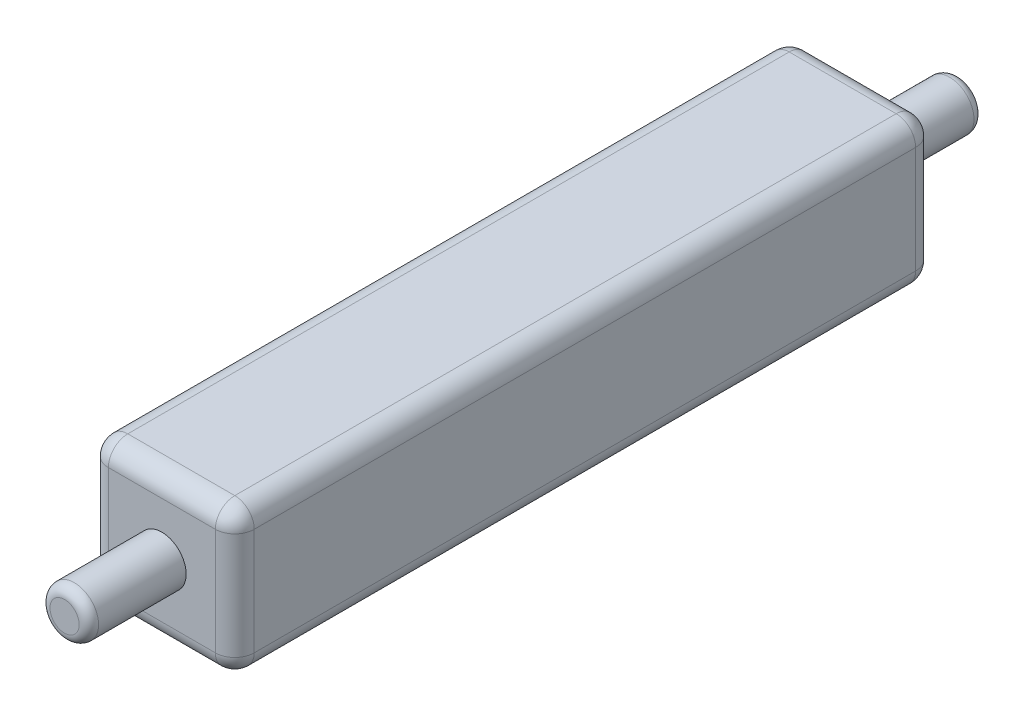
ISO-10303-21;
HEADER;
FILE_DESCRIPTION(('STEP AP214'),'2;1');
FILE_NAME('part.step','',(''),(''),'','','');
FILE_SCHEMA(('AUTOMOTIVE_DESIGN { 1 0 10303 214 1 1 1 1 }'));
ENDSEC;
DATA;
#1=APPLICATION_CONTEXT('core data for automotive mechanical design processes');
#2=APPLICATION_PROTOCOL_DEFINITION('international standard','automotive_design',2000,#1);
#3=PRODUCT_CONTEXT('',#1,'mechanical');
#4=PRODUCT('Part','Part','',(#3));
#5=PRODUCT_RELATED_PRODUCT_CATEGORY('part','',(#4));
#6=PRODUCT_DEFINITION_FORMATION('','',#4);
#7=PRODUCT_DEFINITION_CONTEXT('part definition',#1,'design');
#8=PRODUCT_DEFINITION('design','',#6,#7);
#9=PRODUCT_DEFINITION_SHAPE('','',#8);
#10=(LENGTH_UNIT() NAMED_UNIT(*) SI_UNIT(.MILLI.,.METRE.));
#11=(NAMED_UNIT(*) PLANE_ANGLE_UNIT() SI_UNIT($,.RADIAN.));
#12=(NAMED_UNIT(*) SI_UNIT($,.STERADIAN.) SOLID_ANGLE_UNIT());
#13=UNCERTAINTY_MEASURE_WITH_UNIT(LENGTH_MEASURE(1.E-05),#10,'distance_accuracy_value','');
#14=(GEOMETRIC_REPRESENTATION_CONTEXT(3) GLOBAL_UNCERTAINTY_ASSIGNED_CONTEXT((#13)) GLOBAL_UNIT_ASSIGNED_CONTEXT((#10,
#11,#12)) REPRESENTATION_CONTEXT('',''));
#15=CARTESIAN_POINT('',(0.,0.,0.));
#16=DIRECTION('',(0.,0.,1.));
#17=DIRECTION('',(1.,0.,0.));
#18=AXIS2_PLACEMENT_3D('',#15,#16,#17);
#19=CARTESIAN_POINT('',(-7.5,7.5,-9.));
#20=DIRECTION('',(0.,0.,-1.));
#21=DIRECTION('',(-1.,0.,0.));
#22=AXIS2_PLACEMENT_3D('',#19,#20,#21);
#23=TOROIDAL_SURFACE('',#22,1.5,1.);
#24=CARTESIAN_POINT('',(-7.5,7.5,-10.));
#25=DIRECTION('',(0.,0.,-1.));
#26=DIRECTION('',(-1.,0.,0.));
#27=AXIS2_PLACEMENT_3D('',#24,#25,#26);
#28=CIRCLE('',#27,1.5);
#29=CARTESIAN_POINT('',(-9.,7.5,-10.));
#30=VERTEX_POINT('',#29);
#31=EDGE_CURVE('E41',#30,#30,#28,.T.);
#32=ORIENTED_EDGE('',*,*,#31,.F.);
#33=EDGE_LOOP('',(#32));
#34=FACE_BOUND('',#33,.T.);
#35=CARTESIAN_POINT('',(-7.5,7.5,-9.));
#36=DIRECTION('',(0.,0.,-1.));
#37=DIRECTION('',(-1.,0.,0.));
#38=AXIS2_PLACEMENT_3D('',#35,#36,#37);
#39=CIRCLE('',#38,2.5);
#40=CARTESIAN_POINT('',(-10.,7.5,-9.));
#41=VERTEX_POINT('',#40);
#42=EDGE_CURVE('E11',#41,#41,#39,.F.);
#43=ORIENTED_EDGE('',*,*,#42,.F.);
#44=EDGE_LOOP('',(#43));
#45=FACE_BOUND('',#44,.T.);
#46=ADVANCED_FACE('F34',(#34,#45),#23,.T.);
#47=CARTESIAN_POINT('',(-7.5,7.5,81.));
#48=DIRECTION('',(0.,0.,1.));
#49=DIRECTION('',(1.,0.,0.));
#50=AXIS2_PLACEMENT_3D('',#47,#48,#49);
#51=TOROIDAL_SURFACE('',#50,1.5,1.);
#52=CARTESIAN_POINT('',(-7.5,7.5,82.));
#53=DIRECTION('',(0.,0.,1.));
#54=DIRECTION('',(1.,0.,0.));
#55=AXIS2_PLACEMENT_3D('',#52,#53,#54);
#56=CIRCLE('',#55,1.5);
#57=CARTESIAN_POINT('',(-6.,7.5,82.));
#58=VERTEX_POINT('',#57);
#59=EDGE_CURVE('E376',#58,#58,#56,.T.);
#60=ORIENTED_EDGE('',*,*,#59,.F.);
#61=EDGE_LOOP('',(#60));
#62=FACE_BOUND('',#61,.T.);
#63=CARTESIAN_POINT('',(-7.5,7.5,81.));
#64=DIRECTION('',(0.,0.,1.));
#65=DIRECTION('',(1.,0.,0.));
#66=AXIS2_PLACEMENT_3D('',#63,#64,#65);
#67=CIRCLE('',#66,2.5);
#68=CARTESIAN_POINT('',(-5.,7.5,81.));
#69=VERTEX_POINT('',#68);
#70=EDGE_CURVE('E379',#69,#69,#67,.F.);
#71=ORIENTED_EDGE('',*,*,#70,.F.);
#72=EDGE_LOOP('',(#71));
#73=FACE_BOUND('',#72,.T.);
#74=ADVANCED_FACE('F388',(#62,#73),#51,.T.);
#75=CARTESIAN_POINT('',(0.,2.,70.));
#76=DIRECTION('',(-1.,0.,0.));
#77=DIRECTION('',(0.,-1.,0.));
#78=AXIS2_PLACEMENT_3D('',#75,#76,#77);
#79=CYLINDRICAL_SURFACE('',#78,2.);
#80=CARTESIAN_POINT('',(-2.,2.,70.));
#81=DIRECTION('',(1.,0.,0.));
#82=DIRECTION('',(0.,1.,0.));
#83=AXIS2_PLACEMENT_3D('',#80,#81,#82);
#84=CIRCLE('',#83,2.);
#85=CARTESIAN_POINT('',(-2.,2.,72.));
#86=VERTEX_POINT('',#85);
#87=CARTESIAN_POINT('',(-2.,0.,70.));
#88=VERTEX_POINT('',#87);
#89=EDGE_CURVE('E374',#86,#88,#84,.T.);
#90=ORIENTED_EDGE('',*,*,#89,.F.);
#91=DIRECTION('',(1.,0.,0.));
#92=VECTOR('',#91,1.);
#93=CARTESIAN_POINT('',(0.,2.,72.));
#94=LINE('',#93,#92);
#95=CARTESIAN_POINT('',(-13.,2.,72.));
#96=VERTEX_POINT('',#95);
#97=EDGE_CURVE('E331',#96,#86,#94,.T.);
#98=ORIENTED_EDGE('',*,*,#97,.F.);
#99=CARTESIAN_POINT('',(-13.,2.,70.));
#100=DIRECTION('',(1.,0.,0.));
#101=DIRECTION('',(0.,0.,-1.));
#102=AXIS2_PLACEMENT_3D('',#99,#100,#101);
#103=CIRCLE('',#102,2.);
#104=CARTESIAN_POINT('',(-13.,0.,70.));
#105=VERTEX_POINT('',#104);
#106=EDGE_CURVE('E48',#96,#105,#103,.T.);
#107=ORIENTED_EDGE('',*,*,#106,.T.);
#108=DIRECTION('',(1.,0.,0.));
#109=VECTOR('',#108,1.);
#110=CARTESIAN_POINT('',(0.,0.,70.));
#111=LINE('',#110,#109);
#112=EDGE_CURVE('E360',#88,#105,#111,.F.);
#113=ORIENTED_EDGE('',*,*,#112,.F.);
#114=EDGE_LOOP('',(#90,#98,#107,#113));
#115=FACE_BOUND('',#114,.T.);
#116=ADVANCED_FACE('F499',(#115),#79,.T.);
#117=CARTESIAN_POINT('',(-13.,2.,70.));
#118=DIRECTION('',(0.,0.,1.));
#119=DIRECTION('',(1.,0.,0.));
#120=AXIS2_PLACEMENT_3D('',#117,#118,#119);
#121=SPHERICAL_SURFACE('',#120,2.);
#122=ORIENTED_EDGE('',*,*,#106,.F.);
#123=CARTESIAN_POINT('',(-13.,2.,70.));
#124=DIRECTION('',(0.,-1.,0.));
#125=DIRECTION('',(0.,0.,-1.));
#126=AXIS2_PLACEMENT_3D('',#123,#124,#125);
#127=CIRCLE('',#126,2.);
#128=CARTESIAN_POINT('',(-15.,2.,70.));
#129=VERTEX_POINT('',#128);
#130=EDGE_CURVE('E55',#96,#129,#127,.T.);
#131=ORIENTED_EDGE('',*,*,#130,.T.);
#132=CARTESIAN_POINT('',(-13.,2.,70.));
#133=DIRECTION('',(0.,0.,1.));
#134=DIRECTION('',(1.,0.,0.));
#135=AXIS2_PLACEMENT_3D('',#132,#133,#134);
#136=CIRCLE('',#135,2.);
#137=EDGE_CURVE('E358',#105,#129,#136,.F.);
#138=ORIENTED_EDGE('',*,*,#137,.F.);
#139=EDGE_LOOP('',(#122,#131,#138));
#140=FACE_BOUND('',#139,.T.);
#141=ADVANCED_FACE('F495',(#140),#121,.T.);
#142=CARTESIAN_POINT('',(-13.,0.,70.));
#143=DIRECTION('',(0.,1.,0.));
#144=DIRECTION('',(0.,0.,1.));
#145=AXIS2_PLACEMENT_3D('',#142,#143,#144);
#146=CYLINDRICAL_SURFACE('',#145,2.);
#147=ORIENTED_EDGE('',*,*,#130,.F.);
#148=DIRECTION('',(0.,-1.,0.));
#149=VECTOR('',#148,1.);
#150=CARTESIAN_POINT('',(-13.,0.,72.));
#151=LINE('',#150,#149);
#152=CARTESIAN_POINT('',(-13.,13.,72.));
#153=VERTEX_POINT('',#152);
#154=EDGE_CURVE('E334',#153,#96,#151,.T.);
#155=ORIENTED_EDGE('',*,*,#154,.F.);
#156=CARTESIAN_POINT('',(-13.,13.,70.));
#157=DIRECTION('',(0.,-1.,0.));
#158=DIRECTION('',(0.,0.,-1.));
#159=AXIS2_PLACEMENT_3D('',#156,#157,#158);
#160=CIRCLE('',#159,2.);
#161=CARTESIAN_POINT('',(-15.,13.,70.));
#162=VERTEX_POINT('',#161);
#163=EDGE_CURVE('E370',#153,#162,#160,.T.);
#164=ORIENTED_EDGE('',*,*,#163,.T.);
#165=DIRECTION('',(0.,-1.,0.));
#166=VECTOR('',#165,1.);
#167=CARTESIAN_POINT('',(-15.,0.,70.));
#168=LINE('',#167,#166);
#169=EDGE_CURVE('E355',#129,#162,#168,.F.);
#170=ORIENTED_EDGE('',*,*,#169,.F.);
#171=EDGE_LOOP('',(#147,#155,#164,#170));
#172=FACE_BOUND('',#171,.T.);
#173=ADVANCED_FACE('F491',(#172),#146,.T.);
#174=CARTESIAN_POINT('',(-13.,13.,70.));
#175=DIRECTION('',(0.,0.,1.));
#176=DIRECTION('',(1.,0.,0.));
#177=AXIS2_PLACEMENT_3D('',#174,#175,#176);
#178=SPHERICAL_SURFACE('',#177,2.);
#179=ORIENTED_EDGE('',*,*,#163,.F.);
#180=CARTESIAN_POINT('',(-13.,13.,70.));
#181=DIRECTION('',(-1.,0.,0.));
#182=DIRECTION('',(0.,0.,1.));
#183=AXIS2_PLACEMENT_3D('',#180,#181,#182);
#184=CIRCLE('',#183,2.);
#185=CARTESIAN_POINT('',(-13.,15.,70.));
#186=VERTEX_POINT('',#185);
#187=EDGE_CURVE('E368',#153,#186,#184,.T.);
#188=ORIENTED_EDGE('',*,*,#187,.T.);
#189=CARTESIAN_POINT('',(-13.,13.,70.));
#190=DIRECTION('',(0.,0.,1.));
#191=DIRECTION('',(1.,0.,0.));
#192=AXIS2_PLACEMENT_3D('',#189,#190,#191);
#193=CIRCLE('',#192,2.);
#194=EDGE_CURVE('E352',#162,#186,#193,.F.);
#195=ORIENTED_EDGE('',*,*,#194,.F.);
#196=EDGE_LOOP('',(#179,#188,#195));
#197=FACE_BOUND('',#196,.T.);
#198=ADVANCED_FACE('F487',(#197),#178,.T.);
#199=CARTESIAN_POINT('',(0.,13.,70.));
#200=DIRECTION('',(1.,0.,0.));
#201=DIRECTION('',(0.,1.,0.));
#202=AXIS2_PLACEMENT_3D('',#199,#200,#201);
#203=CYLINDRICAL_SURFACE('',#202,2.);
#204=ORIENTED_EDGE('',*,*,#187,.F.);
#205=DIRECTION('',(-1.,0.,0.));
#206=VECTOR('',#205,1.);
#207=CARTESIAN_POINT('',(0.,13.,72.));
#208=LINE('',#207,#206);
#209=CARTESIAN_POINT('',(-2.,13.,72.));
#210=VERTEX_POINT('',#209);
#211=EDGE_CURVE('E337',#210,#153,#208,.T.);
#212=ORIENTED_EDGE('',*,*,#211,.F.);
#213=CARTESIAN_POINT('',(-2.,13.,70.));
#214=DIRECTION('',(-1.,0.,0.));
#215=DIRECTION('',(0.,-1.,0.));
#216=AXIS2_PLACEMENT_3D('',#213,#214,#215);
#217=CIRCLE('',#216,2.);
#218=CARTESIAN_POINT('',(-2.,15.,70.));
#219=VERTEX_POINT('',#218);
#220=EDGE_CURVE('E366',#210,#219,#217,.T.);
#221=ORIENTED_EDGE('',*,*,#220,.T.);
#222=DIRECTION('',(-1.,0.,0.));
#223=VECTOR('',#222,1.);
#224=CARTESIAN_POINT('',(0.,15.,70.));
#225=LINE('',#224,#223);
#226=EDGE_CURVE('E349',#186,#219,#225,.F.);
#227=ORIENTED_EDGE('',*,*,#226,.F.);
#228=EDGE_LOOP('',(#204,#212,#221,#227));
#229=FACE_BOUND('',#228,.T.);
#230=ADVANCED_FACE('F483',(#229),#203,.T.);
#231=CARTESIAN_POINT('',(-2.,13.,70.));
#232=DIRECTION('',(0.,0.,1.));
#233=DIRECTION('',(1.,0.,0.));
#234=AXIS2_PLACEMENT_3D('',#231,#232,#233);
#235=SPHERICAL_SURFACE('',#234,2.);
#236=ORIENTED_EDGE('',*,*,#220,.F.);
#237=CARTESIAN_POINT('',(-2.,13.,70.));
#238=DIRECTION('',(0.,1.,0.));
#239=DIRECTION('',(0.,0.,1.));
#240=AXIS2_PLACEMENT_3D('',#237,#238,#239);
#241=CIRCLE('',#240,2.);
#242=CARTESIAN_POINT('',(0.,13.,70.));
#243=VERTEX_POINT('',#242);
#244=EDGE_CURVE('E364',#210,#243,#241,.T.);
#245=ORIENTED_EDGE('',*,*,#244,.T.);
#246=CARTESIAN_POINT('',(-2.,13.,70.));
#247=DIRECTION('',(0.,0.,1.));
#248=DIRECTION('',(1.,0.,0.));
#249=AXIS2_PLACEMENT_3D('',#246,#247,#248);
#250=CIRCLE('',#249,2.);
#251=EDGE_CURVE('E346',#219,#243,#250,.F.);
#252=ORIENTED_EDGE('',*,*,#251,.F.);
#253=EDGE_LOOP('',(#236,#245,#252));
#254=FACE_BOUND('',#253,.T.);
#255=ADVANCED_FACE('F479',(#254),#235,.T.);
#256=CARTESIAN_POINT('',(-2.,0.,70.));
#257=DIRECTION('',(0.,-1.,0.));
#258=DIRECTION('',(1.,0.,0.));
#259=AXIS2_PLACEMENT_3D('',#256,#257,#258);
#260=CYLINDRICAL_SURFACE('',#259,2.);
#261=ORIENTED_EDGE('',*,*,#244,.F.);
#262=DIRECTION('',(0.,1.,0.));
#263=VECTOR('',#262,1.);
#264=CARTESIAN_POINT('',(-2.,0.,72.));
#265=LINE('',#264,#263);
#266=EDGE_CURVE('E340',#86,#210,#265,.T.);
#267=ORIENTED_EDGE('',*,*,#266,.F.);
#268=CARTESIAN_POINT('',(-2.,2.,70.));
#269=DIRECTION('',(0.,1.,0.));
#270=DIRECTION('',(0.,0.,1.));
#271=AXIS2_PLACEMENT_3D('',#268,#269,#270);
#272=CIRCLE('',#271,2.);
#273=CARTESIAN_POINT('',(0.,2.,70.));
#274=VERTEX_POINT('',#273);
#275=EDGE_CURVE('E362',#86,#274,#272,.T.);
#276=ORIENTED_EDGE('',*,*,#275,.T.);
#277=DIRECTION('',(0.,1.,0.));
#278=VECTOR('',#277,1.);
#279=CARTESIAN_POINT('',(0.,0.,70.));
#280=LINE('',#279,#278);
#281=EDGE_CURVE('E343',#243,#274,#280,.F.);
#282=ORIENTED_EDGE('',*,*,#281,.F.);
#283=EDGE_LOOP('',(#261,#267,#276,#282));
#284=FACE_BOUND('',#283,.T.);
#285=ADVANCED_FACE('F475',(#284),#260,.T.);
#286=CARTESIAN_POINT('',(-2.,2.,70.));
#287=DIRECTION('',(0.,0.,1.));
#288=DIRECTION('',(1.,0.,0.));
#289=AXIS2_PLACEMENT_3D('',#286,#287,#288);
#290=SPHERICAL_SURFACE('',#289,2.);
#291=ORIENTED_EDGE('',*,*,#275,.F.);
#292=ORIENTED_EDGE('',*,*,#89,.T.);
#293=CARTESIAN_POINT('',(-2.,2.,70.));
#294=DIRECTION('',(0.,0.,1.));
#295=DIRECTION('',(1.,0.,0.));
#296=AXIS2_PLACEMENT_3D('',#293,#294,#295);
#297=CIRCLE('',#296,2.);
#298=EDGE_CURVE('E328',#274,#88,#297,.F.);
#299=ORIENTED_EDGE('',*,*,#298,.F.);
#300=EDGE_LOOP('',(#291,#292,#299));
#301=FACE_BOUND('',#300,.T.);
#302=ADVANCED_FACE('F471',(#301),#290,.T.);
#303=CARTESIAN_POINT('',(-2.,0.,2.));
#304=DIRECTION('',(0.,-1.,0.));
#305=DIRECTION('',(1.,0.,0.));
#306=AXIS2_PLACEMENT_3D('',#303,#304,#305);
#307=CYLINDRICAL_SURFACE('',#306,2.);
#308=CARTESIAN_POINT('',(-2.,2.,2.));
#309=DIRECTION('',(0.,-1.,0.));
#310=DIRECTION('',(0.,0.,-1.));
#311=AXIS2_PLACEMENT_3D('',#308,#309,#310);
#312=CIRCLE('',#311,2.);
#313=CARTESIAN_POINT('',(-2.,2.,0.));
#314=VERTEX_POINT('',#313);
#315=CARTESIAN_POINT('',(0.,2.,2.));
#316=VERTEX_POINT('',#315);
#317=EDGE_CURVE('E325',#314,#316,#312,.T.);
#318=ORIENTED_EDGE('',*,*,#317,.F.);
#319=DIRECTION('',(0.,-1.,0.));
#320=VECTOR('',#319,1.);
#321=CARTESIAN_POINT('',(-2.,0.,0.));
#322=LINE('',#321,#320);
#323=CARTESIAN_POINT('',(-2.,13.,0.));
#324=VERTEX_POINT('',#323);
#325=EDGE_CURVE('E275',#324,#314,#322,.T.);
#326=ORIENTED_EDGE('',*,*,#325,.F.);
#327=CARTESIAN_POINT('',(-2.,13.,2.));
#328=DIRECTION('',(0.,-1.,0.));
#329=DIRECTION('',(0.,0.,-1.));
#330=AXIS2_PLACEMENT_3D('',#327,#328,#329);
#331=CIRCLE('',#330,2.);
#332=CARTESIAN_POINT('',(0.,13.,2.));
#333=VERTEX_POINT('',#332);
#334=EDGE_CURVE('E323',#324,#333,#331,.T.);
#335=ORIENTED_EDGE('',*,*,#334,.T.);
#336=DIRECTION('',(0.,-1.,0.));
#337=VECTOR('',#336,1.);
#338=CARTESIAN_POINT('',(0.,0.,2.));
#339=LINE('',#338,#337);
#340=EDGE_CURVE('E305',#316,#333,#339,.F.);
#341=ORIENTED_EDGE('',*,*,#340,.F.);
#342=EDGE_LOOP('',(#318,#326,#335,#341));
#343=FACE_BOUND('',#342,.T.);
#344=ADVANCED_FACE('F467',(#343),#307,.T.);
#345=CARTESIAN_POINT('',(-2.,13.,2.));
#346=DIRECTION('',(0.,0.,1.));
#347=DIRECTION('',(1.,0.,0.));
#348=AXIS2_PLACEMENT_3D('',#345,#346,#347);
#349=SPHERICAL_SURFACE('',#348,2.);
#350=ORIENTED_EDGE('',*,*,#334,.F.);
#351=CARTESIAN_POINT('',(-2.,13.,2.));
#352=DIRECTION('',(1.,0.,0.));
#353=DIRECTION('',(0.,1.,0.));
#354=AXIS2_PLACEMENT_3D('',#351,#352,#353);
#355=CIRCLE('',#354,2.);
#356=CARTESIAN_POINT('',(-2.,15.,2.));
#357=VERTEX_POINT('',#356);
#358=EDGE_CURVE('E320',#324,#357,#355,.T.);
#359=ORIENTED_EDGE('',*,*,#358,.T.);
#360=CARTESIAN_POINT('',(-2.,13.,2.));
#361=DIRECTION('',(0.,0.,1.));
#362=DIRECTION('',(1.,0.,0.));
#363=AXIS2_PLACEMENT_3D('',#360,#361,#362);
#364=CIRCLE('',#363,2.);
#365=EDGE_CURVE('E302',#333,#357,#364,.T.);
#366=ORIENTED_EDGE('',*,*,#365,.F.);
#367=EDGE_LOOP('',(#350,#359,#366));
#368=FACE_BOUND('',#367,.T.);
#369=ADVANCED_FACE('F463',(#368),#349,.T.);
#370=CARTESIAN_POINT('',(0.,13.,2.));
#371=DIRECTION('',(1.,0.,0.));
#372=DIRECTION('',(0.,1.,0.));
#373=AXIS2_PLACEMENT_3D('',#370,#371,#372);
#374=CYLINDRICAL_SURFACE('',#373,2.);
#375=ORIENTED_EDGE('',*,*,#358,.F.);
#376=DIRECTION('',(1.,0.,0.));
#377=VECTOR('',#376,1.);
#378=CARTESIAN_POINT('',(0.,13.,0.));
#379=LINE('',#378,#377);
#380=CARTESIAN_POINT('',(-13.,13.,0.));
#381=VERTEX_POINT('',#380);
#382=EDGE_CURVE('E278',#381,#324,#379,.T.);
#383=ORIENTED_EDGE('',*,*,#382,.F.);
#384=CARTESIAN_POINT('',(-13.,13.,2.));
#385=DIRECTION('',(1.,0.,0.));
#386=DIRECTION('',(0.,0.,-1.));
#387=AXIS2_PLACEMENT_3D('',#384,#385,#386);
#388=CIRCLE('',#387,2.);
#389=CARTESIAN_POINT('',(-13.,15.,2.));
#390=VERTEX_POINT('',#389);
#391=EDGE_CURVE('E318',#381,#390,#388,.T.);
#392=ORIENTED_EDGE('',*,*,#391,.T.);
#393=DIRECTION('',(1.,0.,0.));
#394=VECTOR('',#393,1.);
#395=CARTESIAN_POINT('',(0.,15.,2.));
#396=LINE('',#395,#394);
#397=EDGE_CURVE('E299',#357,#390,#396,.F.);
#398=ORIENTED_EDGE('',*,*,#397,.F.);
#399=EDGE_LOOP('',(#375,#383,#392,#398));
#400=FACE_BOUND('',#399,.T.);
#401=ADVANCED_FACE('F459',(#400),#374,.T.);
#402=CARTESIAN_POINT('',(-13.,13.,2.));
#403=DIRECTION('',(0.,0.,1.));
#404=DIRECTION('',(1.,0.,0.));
#405=AXIS2_PLACEMENT_3D('',#402,#403,#404);
#406=SPHERICAL_SURFACE('',#405,2.);
#407=ORIENTED_EDGE('',*,*,#391,.F.);
#408=CARTESIAN_POINT('',(-13.,13.,2.));
#409=DIRECTION('',(0.,1.,0.));
#410=DIRECTION('',(0.,0.,1.));
#411=AXIS2_PLACEMENT_3D('',#408,#409,#410);
#412=CIRCLE('',#411,2.);
#413=CARTESIAN_POINT('',(-15.,13.,2.));
#414=VERTEX_POINT('',#413);
#415=EDGE_CURVE('E315',#381,#414,#412,.T.);
#416=ORIENTED_EDGE('',*,*,#415,.T.);
#417=CARTESIAN_POINT('',(-13.,13.,2.));
#418=DIRECTION('',(0.,0.,1.));
#419=DIRECTION('',(1.,0.,0.));
#420=AXIS2_PLACEMENT_3D('',#417,#418,#419);
#421=CIRCLE('',#420,2.);
#422=EDGE_CURVE('E296',#390,#414,#421,.T.);
#423=ORIENTED_EDGE('',*,*,#422,.F.);
#424=EDGE_LOOP('',(#407,#416,#423));
#425=FACE_BOUND('',#424,.T.);
#426=ADVANCED_FACE('F455',(#425),#406,.T.);
#427=CARTESIAN_POINT('',(-13.,0.,2.));
#428=DIRECTION('',(0.,1.,0.));
#429=DIRECTION('',(0.,0.,1.));
#430=AXIS2_PLACEMENT_3D('',#427,#428,#429);
#431=CYLINDRICAL_SURFACE('',#430,2.);
#432=ORIENTED_EDGE('',*,*,#415,.F.);
#433=DIRECTION('',(0.,1.,0.));
#434=VECTOR('',#433,1.);
#435=CARTESIAN_POINT('',(-13.,0.,0.));
#436=LINE('',#435,#434);
#437=CARTESIAN_POINT('',(-13.,2.,0.));
#438=VERTEX_POINT('',#437);
#439=EDGE_CURVE('E281',#438,#381,#436,.T.);
#440=ORIENTED_EDGE('',*,*,#439,.F.);
#441=CARTESIAN_POINT('',(-13.,2.,2.));
#442=DIRECTION('',(0.,1.,0.));
#443=DIRECTION('',(0.,0.,1.));
#444=AXIS2_PLACEMENT_3D('',#441,#442,#443);
#445=CIRCLE('',#444,2.);
#446=CARTESIAN_POINT('',(-15.,2.,2.));
#447=VERTEX_POINT('',#446);
#448=EDGE_CURVE('E313',#438,#447,#445,.T.);
#449=ORIENTED_EDGE('',*,*,#448,.T.);
#450=DIRECTION('',(0.,1.,0.));
#451=VECTOR('',#450,1.);
#452=CARTESIAN_POINT('',(-15.,0.,2.));
#453=LINE('',#452,#451);
#454=EDGE_CURVE('E293',#414,#447,#453,.F.);
#455=ORIENTED_EDGE('',*,*,#454,.F.);
#456=EDGE_LOOP('',(#432,#440,#449,#455));
#457=FACE_BOUND('',#456,.T.);
#458=ADVANCED_FACE('F451',(#457),#431,.T.);
#459=CARTESIAN_POINT('',(-13.,2.,2.));
#460=DIRECTION('',(0.,0.,1.));
#461=DIRECTION('',(1.,0.,0.));
#462=AXIS2_PLACEMENT_3D('',#459,#460,#461);
#463=SPHERICAL_SURFACE('',#462,2.);
#464=ORIENTED_EDGE('',*,*,#448,.F.);
#465=CARTESIAN_POINT('',(-13.,2.,2.));
#466=DIRECTION('',(-1.,0.,0.));
#467=DIRECTION('',(0.,0.,1.));
#468=AXIS2_PLACEMENT_3D('',#465,#466,#467);
#469=CIRCLE('',#468,2.);
#470=CARTESIAN_POINT('',(-13.,0.,2.));
#471=VERTEX_POINT('',#470);
#472=EDGE_CURVE('E310',#438,#471,#469,.T.);
#473=ORIENTED_EDGE('',*,*,#472,.T.);
#474=CARTESIAN_POINT('',(-13.,2.,2.));
#475=DIRECTION('',(0.,0.,1.));
#476=DIRECTION('',(1.,0.,0.));
#477=AXIS2_PLACEMENT_3D('',#474,#475,#476);
#478=CIRCLE('',#477,2.);
#479=EDGE_CURVE('E290',#447,#471,#478,.T.);
#480=ORIENTED_EDGE('',*,*,#479,.F.);
#481=EDGE_LOOP('',(#464,#473,#480));
#482=FACE_BOUND('',#481,.T.);
#483=ADVANCED_FACE('F447',(#482),#463,.T.);
#484=CARTESIAN_POINT('',(0.,2.,2.));
#485=DIRECTION('',(-1.,0.,0.));
#486=DIRECTION('',(0.,-1.,0.));
#487=AXIS2_PLACEMENT_3D('',#484,#485,#486);
#488=CYLINDRICAL_SURFACE('',#487,2.);
#489=ORIENTED_EDGE('',*,*,#472,.F.);
#490=DIRECTION('',(-1.,0.,0.));
#491=VECTOR('',#490,1.);
#492=CARTESIAN_POINT('',(0.,2.,0.));
#493=LINE('',#492,#491);
#494=EDGE_CURVE('E284',#314,#438,#493,.T.);
#495=ORIENTED_EDGE('',*,*,#494,.F.);
#496=CARTESIAN_POINT('',(-2.,2.,2.));
#497=DIRECTION('',(-1.,0.,0.));
#498=DIRECTION('',(0.,-1.,0.));
#499=AXIS2_PLACEMENT_3D('',#496,#497,#498);
#500=CIRCLE('',#499,2.);
#501=CARTESIAN_POINT('',(-2.,0.,2.));
#502=VERTEX_POINT('',#501);
#503=EDGE_CURVE('E308',#314,#502,#500,.T.);
#504=ORIENTED_EDGE('',*,*,#503,.T.);
#505=DIRECTION('',(-1.,0.,0.));
#506=VECTOR('',#505,1.);
#507=CARTESIAN_POINT('',(0.,0.,2.));
#508=LINE('',#507,#506);
#509=EDGE_CURVE('E287',#471,#502,#508,.F.);
#510=ORIENTED_EDGE('',*,*,#509,.F.);
#511=EDGE_LOOP('',(#489,#495,#504,#510));
#512=FACE_BOUND('',#511,.T.);
#513=ADVANCED_FACE('F443',(#512),#488,.T.);
#514=CARTESIAN_POINT('',(-2.,2.,2.));
#515=DIRECTION('',(0.,0.,1.));
#516=DIRECTION('',(1.,0.,0.));
#517=AXIS2_PLACEMENT_3D('',#514,#515,#516);
#518=SPHERICAL_SURFACE('',#517,2.);
#519=ORIENTED_EDGE('',*,*,#503,.F.);
#520=ORIENTED_EDGE('',*,*,#317,.T.);
#521=CARTESIAN_POINT('',(-2.,2.,2.));
#522=DIRECTION('',(0.,0.,1.));
#523=DIRECTION('',(1.,0.,0.));
#524=AXIS2_PLACEMENT_3D('',#521,#522,#523);
#525=CIRCLE('',#524,2.);
#526=EDGE_CURVE('E272',#502,#316,#525,.T.);
#527=ORIENTED_EDGE('',*,*,#526,.F.);
#528=EDGE_LOOP('',(#519,#520,#527));
#529=FACE_BOUND('',#528,.T.);
#530=ADVANCED_FACE('F439',(#529),#518,.T.);
#531=CARTESIAN_POINT('',(-13.,2.,72.));
#532=DIRECTION('',(0.,0.,1.));
#533=DIRECTION('',(1.,0.,0.));
#534=AXIS2_PLACEMENT_3D('',#531,#532,#533);
#535=CYLINDRICAL_SURFACE('',#534,2.);
#536=DIRECTION('',(0.,0.,1.));
#537=VECTOR('',#536,1.);
#538=CARTESIAN_POINT('',(-13.,0.,72.));
#539=LINE('',#538,#537);
#540=EDGE_CURVE('E270',#105,#471,#539,.F.);
#541=ORIENTED_EDGE('',*,*,#540,.F.);
#542=ORIENTED_EDGE('',*,*,#137,.T.);
#543=DIRECTION('',(0.,0.,1.));
#544=VECTOR('',#543,1.);
#545=CARTESIAN_POINT('',(-15.,2.,72.));
#546=LINE('',#545,#544);
#547=EDGE_CURVE('E267',#447,#129,#546,.T.);
#548=ORIENTED_EDGE('',*,*,#547,.F.);
#549=ORIENTED_EDGE('',*,*,#479,.T.);
#550=EDGE_LOOP('',(#541,#542,#548,#549));
#551=FACE_BOUND('',#550,.T.);
#552=ADVANCED_FACE('F435',(#551),#535,.T.);
#553=CARTESIAN_POINT('',(-2.,2.,72.));
#554=DIRECTION('',(0.,0.,1.));
#555=DIRECTION('',(1.,0.,0.));
#556=AXIS2_PLACEMENT_3D('',#553,#554,#555);
#557=CYLINDRICAL_SURFACE('',#556,2.);
#558=DIRECTION('',(0.,0.,1.));
#559=VECTOR('',#558,1.);
#560=CARTESIAN_POINT('',(0.,2.,72.));
#561=LINE('',#560,#559);
#562=EDGE_CURVE('E265',#274,#316,#561,.F.);
#563=ORIENTED_EDGE('',*,*,#562,.F.);
#564=ORIENTED_EDGE('',*,*,#298,.T.);
#565=DIRECTION('',(0.,0.,1.));
#566=VECTOR('',#565,1.);
#567=CARTESIAN_POINT('',(-2.,0.,72.));
#568=LINE('',#567,#566);
#569=EDGE_CURVE('E262',#502,#88,#568,.T.);
#570=ORIENTED_EDGE('',*,*,#569,.F.);
#571=ORIENTED_EDGE('',*,*,#526,.T.);
#572=EDGE_LOOP('',(#563,#564,#570,#571));
#573=FACE_BOUND('',#572,.T.);
#574=ADVANCED_FACE('F431',(#573),#557,.T.);
#575=CARTESIAN_POINT('',(-2.,13.,72.));
#576=DIRECTION('',(0.,0.,1.));
#577=DIRECTION('',(1.,0.,0.));
#578=AXIS2_PLACEMENT_3D('',#575,#576,#577);
#579=CYLINDRICAL_SURFACE('',#578,2.);
#580=DIRECTION('',(0.,0.,1.));
#581=VECTOR('',#580,1.);
#582=CARTESIAN_POINT('',(-2.,15.,72.));
#583=LINE('',#582,#581);
#584=EDGE_CURVE('E260',#219,#357,#583,.F.);
#585=ORIENTED_EDGE('',*,*,#584,.F.);
#586=ORIENTED_EDGE('',*,*,#251,.T.);
#587=DIRECTION('',(0.,0.,1.));
#588=VECTOR('',#587,1.);
#589=CARTESIAN_POINT('',(0.,13.,72.));
#590=LINE('',#589,#588);
#591=EDGE_CURVE('E257',#333,#243,#590,.T.);
#592=ORIENTED_EDGE('',*,*,#591,.F.);
#593=ORIENTED_EDGE('',*,*,#365,.T.);
#594=EDGE_LOOP('',(#585,#586,#592,#593));
#595=FACE_BOUND('',#594,.T.);
#596=ADVANCED_FACE('F427',(#595),#579,.T.);
#597=CARTESIAN_POINT('',(-13.,13.,72.));
#598=DIRECTION('',(0.,0.,1.));
#599=DIRECTION('',(1.,0.,0.));
#600=AXIS2_PLACEMENT_3D('',#597,#598,#599);
#601=CYLINDRICAL_SURFACE('',#600,2.);
#602=DIRECTION('',(0.,0.,1.));
#603=VECTOR('',#602,1.);
#604=CARTESIAN_POINT('',(-15.,13.,72.));
#605=LINE('',#604,#603);
#606=EDGE_CURVE('E255',#162,#414,#605,.F.);
#607=ORIENTED_EDGE('',*,*,#606,.F.);
#608=ORIENTED_EDGE('',*,*,#194,.T.);
#609=DIRECTION('',(0.,0.,1.));
#610=VECTOR('',#609,1.);
#611=CARTESIAN_POINT('',(-13.,15.,72.));
#612=LINE('',#611,#610);
#613=EDGE_CURVE('E250',#390,#186,#612,.T.);
#614=ORIENTED_EDGE('',*,*,#613,.F.);
#615=ORIENTED_EDGE('',*,*,#422,.T.);
#616=EDGE_LOOP('',(#607,#608,#614,#615));
#617=FACE_BOUND('',#616,.T.);
#618=ADVANCED_FACE('F423',(#617),#601,.T.);
#619=CARTESIAN_POINT('',(0.,0.,72.));
#620=DIRECTION('',(-1.,0.,0.));
#621=DIRECTION('',(0.,-1.,0.));
#622=AXIS2_PLACEMENT_3D('',#619,#620,#621);
#623=PLANE('',#622);
#624=ORIENTED_EDGE('',*,*,#591,.T.);
#625=ORIENTED_EDGE('',*,*,#281,.T.);
#626=ORIENTED_EDGE('',*,*,#562,.T.);
#627=ORIENTED_EDGE('',*,*,#340,.T.);
#628=EDGE_LOOP('',(#624,#625,#626,#627));
#629=FACE_BOUND('',#628,.T.);
#630=ADVANCED_FACE('F419',(#629),#623,.F.);
#631=CARTESIAN_POINT('',(0.,15.,72.));
#632=DIRECTION('',(0.,-1.,0.));
#633=DIRECTION('',(1.,0.,0.));
#634=AXIS2_PLACEMENT_3D('',#631,#632,#633);
#635=PLANE('',#634);
#636=ORIENTED_EDGE('',*,*,#613,.T.);
#637=ORIENTED_EDGE('',*,*,#226,.T.);
#638=ORIENTED_EDGE('',*,*,#584,.T.);
#639=ORIENTED_EDGE('',*,*,#397,.T.);
#640=EDGE_LOOP('',(#636,#637,#638,#639));
#641=FACE_BOUND('',#640,.T.);
#642=ADVANCED_FACE('F415',(#641),#635,.F.);
#643=CARTESIAN_POINT('',(-15.,0.,72.));
#644=DIRECTION('',(1.,0.,0.));
#645=DIRECTION('',(0.,0.,-1.));
#646=AXIS2_PLACEMENT_3D('',#643,#644,#645);
#647=PLANE('',#646);
#648=DIRECTION('',(0.,0.,-1.));
#649=VECTOR('',#648,1.);
#650=CARTESIAN_POINT('',(-15.,8.30636670318551,20.));
#651=LINE('',#650,#649);
#652=CARTESIAN_POINT('',(-15.,8.30636670318551,20.));
#653=VERTEX_POINT('',#652);
#654=CARTESIAN_POINT('',(-15.,8.30636670318551,10.));
#655=VERTEX_POINT('',#654);
#656=EDGE_CURVE('E205',#653,#655,#651,.T.);
#657=ORIENTED_EDGE('',*,*,#656,.F.);
#658=CARTESIAN_POINT('',(-15.,7.30636670318551,20.));
#659=DIRECTION('',(-1.,0.,0.));
#660=DIRECTION('',(0.,0.,1.));
#661=AXIS2_PLACEMENT_3D('',#658,#659,#660);
#662=CIRCLE('',#661,0.999999999999998);
#663=CARTESIAN_POINT('',(-15.,6.30636670318552,20.));
#664=VERTEX_POINT('',#663);
#665=EDGE_CURVE('E179',#664,#653,#662,.T.);
#666=ORIENTED_EDGE('',*,*,#665,.F.);
#667=DIRECTION('',(0.,0.,1.));
#668=VECTOR('',#667,1.);
#669=CARTESIAN_POINT('',(-15.,6.30636670318552,20.));
#670=LINE('',#669,#668);
#671=CARTESIAN_POINT('',(-15.,6.30636670318551,10.));
#672=VERTEX_POINT('',#671);
#673=EDGE_CURVE('E196',#672,#664,#670,.T.);
#674=ORIENTED_EDGE('',*,*,#673,.F.);
#675=CARTESIAN_POINT('',(-15.,7.30636670318551,10.));
#676=DIRECTION('',(-1.,0.,0.));
#677=DIRECTION('',(0.,0.,1.));
#678=AXIS2_PLACEMENT_3D('',#675,#676,#677);
#679=CIRCLE('',#678,1.);
#680=EDGE_CURVE('E199',#655,#672,#679,.T.);
#681=ORIENTED_EDGE('',*,*,#680,.F.);
#682=EDGE_LOOP('',(#657,#666,#674,#681));
#683=FACE_BOUND('',#682,.T.);
#684=DIRECTION('',(0.,0.,1.));
#685=VECTOR('',#684,1.);
#686=CARTESIAN_POINT('',(-15.,6.30636670318552,52.));
#687=LINE('',#686,#685);
#688=CARTESIAN_POINT('',(-15.,6.30636670318552,52.));
#689=VERTEX_POINT('',#688);
#690=CARTESIAN_POINT('',(-15.,6.30636670318552,62.));
#691=VERTEX_POINT('',#690);
#692=EDGE_CURVE('E232',#689,#691,#687,.T.);
#693=ORIENTED_EDGE('',*,*,#692,.F.);
#694=CARTESIAN_POINT('',(-15.,7.30636670318552,52.));
#695=DIRECTION('',(-1.,0.,0.));
#696=DIRECTION('',(0.,0.,1.));
#697=AXIS2_PLACEMENT_3D('',#694,#695,#696);
#698=CIRCLE('',#697,0.999999999999999);
#699=CARTESIAN_POINT('',(-15.,8.30636670318552,52.));
#700=VERTEX_POINT('',#699);
#701=EDGE_CURVE('E230',#700,#689,#698,.T.);
#702=ORIENTED_EDGE('',*,*,#701,.F.);
#703=DIRECTION('',(0.,0.,-1.));
#704=VECTOR('',#703,1.);
#705=CARTESIAN_POINT('',(-15.,8.30636670318552,52.));
#706=LINE('',#705,#704);
#707=CARTESIAN_POINT('',(-15.,8.30636670318552,62.));
#708=VERTEX_POINT('',#707);
#709=EDGE_CURVE('E220',#708,#700,#706,.T.);
#710=ORIENTED_EDGE('',*,*,#709,.F.);
#711=CARTESIAN_POINT('',(-15.,7.30636670318552,62.));
#712=DIRECTION('',(-1.,0.,0.));
#713=DIRECTION('',(0.,0.,1.));
#714=AXIS2_PLACEMENT_3D('',#711,#712,#713);
#715=CIRCLE('',#714,0.999999999999999);
#716=EDGE_CURVE('E235',#691,#708,#715,.T.);
#717=ORIENTED_EDGE('',*,*,#716,.F.);
#718=EDGE_LOOP('',(#693,#702,#710,#717));
#719=FACE_BOUND('',#718,.T.);
#720=ORIENTED_EDGE('',*,*,#547,.T.);
#721=ORIENTED_EDGE('',*,*,#169,.T.);
#722=ORIENTED_EDGE('',*,*,#606,.T.);
#723=ORIENTED_EDGE('',*,*,#454,.T.);
#724=EDGE_LOOP('',(#720,#721,#722,#723));
#725=FACE_BOUND('',#724,.T.);
#726=ADVANCED_FACE('F411',(#683,#719,#725),#647,.F.);
#727=CARTESIAN_POINT('',(0.,0.,72.));
#728=DIRECTION('',(0.,1.,0.));
#729=DIRECTION('',(-1.,0.,0.));
#730=AXIS2_PLACEMENT_3D('',#727,#728,#729);
#731=PLANE('',#730);
#732=ORIENTED_EDGE('',*,*,#569,.T.);
#733=ORIENTED_EDGE('',*,*,#112,.T.);
#734=ORIENTED_EDGE('',*,*,#540,.T.);
#735=ORIENTED_EDGE('',*,*,#509,.T.);
#736=EDGE_LOOP('',(#732,#733,#734,#735));
#737=FACE_BOUND('',#736,.T.);
#738=ADVANCED_FACE('F405',(#737),#731,.F.);
#739=CARTESIAN_POINT('',(0.,0.,72.));
#740=DIRECTION('',(0.,0.,1.));
#741=DIRECTION('',(1.,0.,0.));
#742=AXIS2_PLACEMENT_3D('',#739,#740,#741);
#743=PLANE('',#742);
#744=ORIENTED_EDGE('',*,*,#97,.T.);
#745=ORIENTED_EDGE('',*,*,#266,.T.);
#746=ORIENTED_EDGE('',*,*,#211,.T.);
#747=ORIENTED_EDGE('',*,*,#154,.T.);
#748=EDGE_LOOP('',(#744,#745,#746,#747));
#749=FACE_BOUND('',#748,.T.);
#750=CARTESIAN_POINT('',(-7.5,7.5,72.));
#751=DIRECTION('',(0.,0.,1.));
#752=DIRECTION('',(1.,0.,0.));
#753=AXIS2_PLACEMENT_3D('',#750,#751,#752);
#754=CIRCLE('',#753,2.5);
#755=CARTESIAN_POINT('',(-5.,7.5,72.));
#756=VERTEX_POINT('',#755);
#757=EDGE_CURVE('E247',#756,#756,#754,.T.);
#758=ORIENTED_EDGE('',*,*,#757,.F.);
#759=EDGE_LOOP('',(#758));
#760=FACE_BOUND('',#759,.T.);
#761=ADVANCED_FACE('F399',(#749,#760),#743,.T.);
#762=CARTESIAN_POINT('',(0.,0.,0.));
#763=DIRECTION('',(0.,0.,1.));
#764=DIRECTION('',(1.,0.,0.));
#765=AXIS2_PLACEMENT_3D('',#762,#763,#764);
#766=PLANE('',#765);
#767=ORIENTED_EDGE('',*,*,#325,.T.);
#768=ORIENTED_EDGE('',*,*,#494,.T.);
#769=ORIENTED_EDGE('',*,*,#439,.T.);
#770=ORIENTED_EDGE('',*,*,#382,.T.);
#771=EDGE_LOOP('',(#767,#768,#769,#770));
#772=FACE_BOUND('',#771,.T.);
#773=CARTESIAN_POINT('',(-7.5,7.5,0.));
#774=DIRECTION('',(0.,0.,-1.));
#775=DIRECTION('',(-1.,0.,0.));
#776=AXIS2_PLACEMENT_3D('',#773,#774,#775);
#777=CIRCLE('',#776,2.5);
#778=CARTESIAN_POINT('',(-10.,7.5,0.));
#779=VERTEX_POINT('',#778);
#780=EDGE_CURVE('E212',#779,#779,#777,.T.);
#781=ORIENTED_EDGE('',*,*,#780,.F.);
#782=EDGE_LOOP('',(#781));
#783=FACE_BOUND('',#782,.T.);
#784=ADVANCED_FACE('F394',(#772,#783),#766,.F.);
#785=CARTESIAN_POINT('',(-7.5,7.5,-10.));
#786=DIRECTION('',(0.,0.,1.));
#787=DIRECTION('',(1.,0.,0.));
#788=AXIS2_PLACEMENT_3D('',#785,#786,#787);
#789=CYLINDRICAL_SURFACE('',#788,2.5);
#790=ORIENTED_EDGE('',*,*,#42,.T.);
#791=EDGE_LOOP('',(#790));
#792=FACE_BOUND('',#791,.T.);
#793=ORIENTED_EDGE('',*,*,#780,.T.);
#794=EDGE_LOOP('',(#793));
#795=FACE_BOUND('',#794,.T.);
#796=ADVANCED_FACE('F391',(#792,#795),#789,.T.);
#797=CARTESIAN_POINT('',(-7.5,7.5,-10.));
#798=DIRECTION('',(0.,0.,-1.));
#799=DIRECTION('',(-1.,0.,0.));
#800=AXIS2_PLACEMENT_3D('',#797,#798,#799);
#801=PLANE('',#800);
#802=ORIENTED_EDGE('',*,*,#31,.T.);
#803=EDGE_LOOP('',(#802));
#804=FACE_BOUND('',#803,.T.);
#805=ADVANCED_FACE('F384',(#804),#801,.T.);
#806=CARTESIAN_POINT('',(-7.5,7.5,82.));
#807=DIRECTION('',(0.,0.,-1.));
#808=DIRECTION('',(-1.,0.,0.));
#809=AXIS2_PLACEMENT_3D('',#806,#807,#808);
#810=CYLINDRICAL_SURFACE('',#809,2.5);
#811=ORIENTED_EDGE('',*,*,#70,.T.);
#812=EDGE_LOOP('',(#811));
#813=FACE_BOUND('',#812,.T.);
#814=ORIENTED_EDGE('',*,*,#757,.T.);
#815=EDGE_LOOP('',(#814));
#816=FACE_BOUND('',#815,.T.);
#817=ADVANCED_FACE('F509',(#813,#816),#810,.T.);
#818=CARTESIAN_POINT('',(-7.5,7.5,82.));
#819=DIRECTION('',(0.,0.,1.));
#820=DIRECTION('',(1.,0.,0.));
#821=AXIS2_PLACEMENT_3D('',#818,#819,#820);
#822=PLANE('',#821);
#823=ORIENTED_EDGE('',*,*,#59,.T.);
#824=EDGE_LOOP('',(#823));
#825=FACE_BOUND('',#824,.T.);
#826=ADVANCED_FACE('F512',(#825),#822,.T.);
#827=CARTESIAN_POINT('',(-5.,7.30636670318552,52.));
#828=DIRECTION('',(-1.,0.,0.));
#829=DIRECTION('',(0.,0.,1.));
#830=AXIS2_PLACEMENT_3D('',#827,#828,#829);
#831=CYLINDRICAL_SURFACE('',#830,0.999999999999999);
#832=ORIENTED_EDGE('',*,*,#701,.T.);
#833=DIRECTION('',(-1.,0.,0.));
#834=VECTOR('',#833,1.);
#835=CARTESIAN_POINT('',(-5.,6.30636670318552,52.));
#836=LINE('',#835,#834);
#837=CARTESIAN_POINT('',(-5.,6.30636670318552,52.));
#838=VERTEX_POINT('',#837);
#839=EDGE_CURVE('E229',#838,#689,#836,.T.);
#840=ORIENTED_EDGE('',*,*,#839,.F.);
#841=CARTESIAN_POINT('',(-5.,7.30636670318552,52.));
#842=DIRECTION('',(-1.,0.,0.));
#843=DIRECTION('',(0.,0.,1.));
#844=AXIS2_PLACEMENT_3D('',#841,#842,#843);
#845=CIRCLE('',#844,0.999999999999999);
#846=CARTESIAN_POINT('',(-5.,8.30636670318552,52.));
#847=VERTEX_POINT('',#846);
#848=EDGE_CURVE('E216',#847,#838,#845,.T.);
#849=ORIENTED_EDGE('',*,*,#848,.F.);
#850=DIRECTION('',(-1.,0.,0.));
#851=VECTOR('',#850,1.);
#852=CARTESIAN_POINT('',(-5.,8.30636670318552,52.));
#853=LINE('',#852,#851);
#854=EDGE_CURVE('E206',#847,#700,#853,.T.);
#855=ORIENTED_EDGE('',*,*,#854,.T.);
#856=EDGE_LOOP('',(#832,#840,#849,#855));
#857=FACE_BOUND('',#856,.T.);
#858=ADVANCED_FACE('F520',(#857),#831,.F.);
#859=CARTESIAN_POINT('',(-5.,8.30636670318552,52.));
#860=DIRECTION('',(0.,1.,0.));
#861=DIRECTION('',(0.,0.,1.));
#862=AXIS2_PLACEMENT_3D('',#859,#860,#861);
#863=PLANE('',#862);
#864=ORIENTED_EDGE('',*,*,#709,.T.);
#865=ORIENTED_EDGE('',*,*,#854,.F.);
#866=DIRECTION('',(0.,0.,-1.));
#867=VECTOR('',#866,1.);
#868=CARTESIAN_POINT('',(-5.,8.30636670318552,52.));
#869=LINE('',#868,#867);
#870=CARTESIAN_POINT('',(-5.,8.30636670318552,62.));
#871=VERTEX_POINT('',#870);
#872=EDGE_CURVE('E226',#871,#847,#869,.T.);
#873=ORIENTED_EDGE('',*,*,#872,.F.);
#874=DIRECTION('',(-1.,0.,0.));
#875=VECTOR('',#874,1.);
#876=CARTESIAN_POINT('',(-5.,8.30636670318552,62.));
#877=LINE('',#876,#875);
#878=EDGE_CURVE('E241',#871,#708,#877,.T.);
#879=ORIENTED_EDGE('',*,*,#878,.T.);
#880=EDGE_LOOP('',(#864,#865,#873,#879));
#881=FACE_BOUND('',#880,.T.);
#882=ADVANCED_FACE('F527',(#881),#863,.F.);
#883=CARTESIAN_POINT('',(-5.,7.30636670318552,62.));
#884=DIRECTION('',(-1.,0.,0.));
#885=DIRECTION('',(0.,0.,1.));
#886=AXIS2_PLACEMENT_3D('',#883,#884,#885);
#887=CYLINDRICAL_SURFACE('',#886,0.999999999999999);
#888=ORIENTED_EDGE('',*,*,#716,.T.);
#889=ORIENTED_EDGE('',*,*,#878,.F.);
#890=CARTESIAN_POINT('',(-5.,7.30636670318552,62.));
#891=DIRECTION('',(-1.,0.,0.));
#892=DIRECTION('',(0.,0.,1.));
#893=AXIS2_PLACEMENT_3D('',#890,#891,#892);
#894=CIRCLE('',#893,0.999999999999999);
#895=CARTESIAN_POINT('',(-5.,6.30636670318552,62.));
#896=VERTEX_POINT('',#895);
#897=EDGE_CURVE('E223',#896,#871,#894,.T.);
#898=ORIENTED_EDGE('',*,*,#897,.F.);
#899=DIRECTION('',(-1.,0.,0.));
#900=VECTOR('',#899,1.);
#901=CARTESIAN_POINT('',(-5.,6.30636670318552,62.));
#902=LINE('',#901,#900);
#903=EDGE_CURVE('E243',#896,#691,#902,.T.);
#904=ORIENTED_EDGE('',*,*,#903,.T.);
#905=EDGE_LOOP('',(#888,#889,#898,#904));
#906=FACE_BOUND('',#905,.T.);
#907=ADVANCED_FACE('F533',(#906),#887,.F.);
#908=CARTESIAN_POINT('',(-5.,6.30636670318552,52.));
#909=DIRECTION('',(0.,-1.,0.));
#910=DIRECTION('',(0.,0.,-1.));
#911=AXIS2_PLACEMENT_3D('',#908,#909,#910);
#912=PLANE('',#911);
#913=ORIENTED_EDGE('',*,*,#692,.T.);
#914=ORIENTED_EDGE('',*,*,#903,.F.);
#915=DIRECTION('',(0.,0.,1.));
#916=VECTOR('',#915,1.);
#917=CARTESIAN_POINT('',(-5.,6.30636670318552,52.));
#918=LINE('',#917,#916);
#919=EDGE_CURVE('E219',#838,#896,#918,.T.);
#920=ORIENTED_EDGE('',*,*,#919,.F.);
#921=ORIENTED_EDGE('',*,*,#839,.T.);
#922=EDGE_LOOP('',(#913,#914,#920,#921));
#923=FACE_BOUND('',#922,.T.);
#924=ADVANCED_FACE('F529',(#923),#912,.F.);
#925=CARTESIAN_POINT('',(-5.,7.30636670318552,52.));
#926=DIRECTION('',(-1.,0.,0.));
#927=DIRECTION('',(0.,0.,1.));
#928=AXIS2_PLACEMENT_3D('',#925,#926,#927);
#929=PLANE('',#928);
#930=ORIENTED_EDGE('',*,*,#848,.T.);
#931=ORIENTED_EDGE('',*,*,#919,.T.);
#932=ORIENTED_EDGE('',*,*,#897,.T.);
#933=ORIENTED_EDGE('',*,*,#872,.T.);
#934=EDGE_LOOP('',(#930,#931,#932,#933));
#935=FACE_BOUND('',#934,.T.);
#936=ADVANCED_FACE('F532',(#935),#929,.T.);
#937=CARTESIAN_POINT('',(-5.,7.30636670318551,20.));
#938=DIRECTION('',(-1.,0.,0.));
#939=DIRECTION('',(0.,0.,1.));
#940=AXIS2_PLACEMENT_3D('',#937,#938,#939);
#941=CYLINDRICAL_SURFACE('',#940,0.999999999999998);
#942=ORIENTED_EDGE('',*,*,#665,.T.);
#943=DIRECTION('',(-1.,0.,0.));
#944=VECTOR('',#943,1.);
#945=CARTESIAN_POINT('',(-5.,8.30636670318551,20.));
#946=LINE('',#945,#944);
#947=CARTESIAN_POINT('',(-5.,8.30636670318551,20.));
#948=VERTEX_POINT('',#947);
#949=EDGE_CURVE('E172',#948,#653,#946,.T.);
#950=ORIENTED_EDGE('',*,*,#949,.F.);
#951=CARTESIAN_POINT('',(-5.,7.30636670318551,20.));
#952=DIRECTION('',(-1.,0.,0.));
#953=DIRECTION('',(0.,0.,1.));
#954=AXIS2_PLACEMENT_3D('',#951,#952,#953);
#955=CIRCLE('',#954,0.999999999999998);
#956=CARTESIAN_POINT('',(-5.,6.30636670318552,20.));
#957=VERTEX_POINT('',#956);
#958=EDGE_CURVE('E176',#957,#948,#955,.T.);
#959=ORIENTED_EDGE('',*,*,#958,.F.);
#960=DIRECTION('',(-1.,0.,0.));
#961=VECTOR('',#960,1.);
#962=CARTESIAN_POINT('',(-5.,6.30636670318552,20.));
#963=LINE('',#962,#961);
#964=EDGE_CURVE('E210',#957,#664,#963,.T.);
#965=ORIENTED_EDGE('',*,*,#964,.T.);
#966=EDGE_LOOP('',(#942,#950,#959,#965));
#967=FACE_BOUND('',#966,.T.);
#968=ADVANCED_FACE('F174',(#967),#941,.F.);
#969=CARTESIAN_POINT('',(-5.,6.30636670318552,20.));
#970=DIRECTION('',(0.,-1.,0.));
#971=DIRECTION('',(0.,0.,-1.));
#972=AXIS2_PLACEMENT_3D('',#969,#970,#971);
#973=PLANE('',#972);
#974=ORIENTED_EDGE('',*,*,#673,.T.);
#975=ORIENTED_EDGE('',*,*,#964,.F.);
#976=DIRECTION('',(0.,0.,1.));
#977=VECTOR('',#976,1.);
#978=CARTESIAN_POINT('',(-5.,6.30636670318552,20.));
#979=LINE('',#978,#977);
#980=CARTESIAN_POINT('',(-5.,6.30636670318551,10.));
#981=VERTEX_POINT('',#980);
#982=EDGE_CURVE('E184',#981,#957,#979,.T.);
#983=ORIENTED_EDGE('',*,*,#982,.F.);
#984=DIRECTION('',(-1.,0.,0.));
#985=VECTOR('',#984,1.);
#986=CARTESIAN_POINT('',(-5.,6.30636670318551,10.));
#987=LINE('',#986,#985);
#988=EDGE_CURVE('E213',#981,#672,#987,.T.);
#989=ORIENTED_EDGE('',*,*,#988,.T.);
#990=EDGE_LOOP('',(#974,#975,#983,#989));
#991=FACE_BOUND('',#990,.T.);
#992=ADVANCED_FACE('F546',(#991),#973,.F.);
#993=CARTESIAN_POINT('',(-5.,7.30636670318551,10.));
#994=DIRECTION('',(-1.,0.,0.));
#995=DIRECTION('',(0.,0.,1.));
#996=AXIS2_PLACEMENT_3D('',#993,#994,#995);
#997=CYLINDRICAL_SURFACE('',#996,1.);
#998=ORIENTED_EDGE('',*,*,#680,.T.);
#999=ORIENTED_EDGE('',*,*,#988,.F.);
#1000=CARTESIAN_POINT('',(-5.,7.30636670318551,10.));
#1001=DIRECTION('',(-1.,0.,0.));
#1002=DIRECTION('',(0.,0.,1.));
#1003=AXIS2_PLACEMENT_3D('',#1000,#1001,#1002);
#1004=CIRCLE('',#1003,1.);
#1005=CARTESIAN_POINT('',(-5.,8.30636670318551,10.));
#1006=VERTEX_POINT('',#1005);
#1007=EDGE_CURVE('E192',#1006,#981,#1004,.T.);
#1008=ORIENTED_EDGE('',*,*,#1007,.F.);
#1009=DIRECTION('',(-1.,0.,0.));
#1010=VECTOR('',#1009,1.);
#1011=CARTESIAN_POINT('',(-5.,8.30636670318551,10.));
#1012=LINE('',#1011,#1010);
#1013=EDGE_CURVE('E183',#1006,#655,#1012,.T.);
#1014=ORIENTED_EDGE('',*,*,#1013,.T.);
#1015=EDGE_LOOP('',(#998,#999,#1008,#1014));
#1016=FACE_BOUND('',#1015,.T.);
#1017=ADVANCED_FACE('F549',(#1016),#997,.F.);
#1018=CARTESIAN_POINT('',(-5.,8.30636670318551,20.));
#1019=DIRECTION('',(0.,1.,0.));
#1020=DIRECTION('',(0.,0.,1.));
#1021=AXIS2_PLACEMENT_3D('',#1018,#1019,#1020);
#1022=PLANE('',#1021);
#1023=ORIENTED_EDGE('',*,*,#656,.T.);
#1024=ORIENTED_EDGE('',*,*,#1013,.F.);
#1025=DIRECTION('',(0.,0.,-1.));
#1026=VECTOR('',#1025,1.);
#1027=CARTESIAN_POINT('',(-5.,8.30636670318551,20.));
#1028=LINE('',#1027,#1026);
#1029=EDGE_CURVE('E187',#948,#1006,#1028,.T.);
#1030=ORIENTED_EDGE('',*,*,#1029,.F.);
#1031=ORIENTED_EDGE('',*,*,#949,.T.);
#1032=EDGE_LOOP('',(#1023,#1024,#1030,#1031));
#1033=FACE_BOUND('',#1032,.T.);
#1034=ADVANCED_FACE('F188',(#1033),#1022,.F.);
#1035=CARTESIAN_POINT('',(-5.,7.30636670318551,20.));
#1036=DIRECTION('',(-1.,0.,0.));
#1037=DIRECTION('',(0.,0.,1.));
#1038=AXIS2_PLACEMENT_3D('',#1035,#1036,#1037);
#1039=PLANE('',#1038);
#1040=ORIENTED_EDGE('',*,*,#958,.T.);
#1041=ORIENTED_EDGE('',*,*,#1029,.T.);
#1042=ORIENTED_EDGE('',*,*,#1007,.T.);
#1043=ORIENTED_EDGE('',*,*,#982,.T.);
#1044=EDGE_LOOP('',(#1040,#1041,#1042,#1043));
#1045=FACE_BOUND('',#1044,.T.);
#1046=ADVANCED_FACE('F194',(#1045),#1039,.T.);
#1047=CLOSED_SHELL('',(#46,#74,#116,#141,#173,#198,#230,#255,#285,#302,#344,#369,#401,#426,#458,
#483,#513,#530,#552,#574,#596,#618,#630,#642,#726,#738,#761,#784,#796,#805,#817,#826,#858,#882,
#907,#924,#936,#968,#992,#1017,#1034,#1046));
#1048=MANIFOLD_SOLID_BREP('B2',#1047);
#1049=ADVANCED_BREP_SHAPE_REPRESENTATION('',(#18,#1048),#14);
#1050=SHAPE_DEFINITION_REPRESENTATION(#9,#1049);
ENDSEC;
END-ISO-10303-21;
